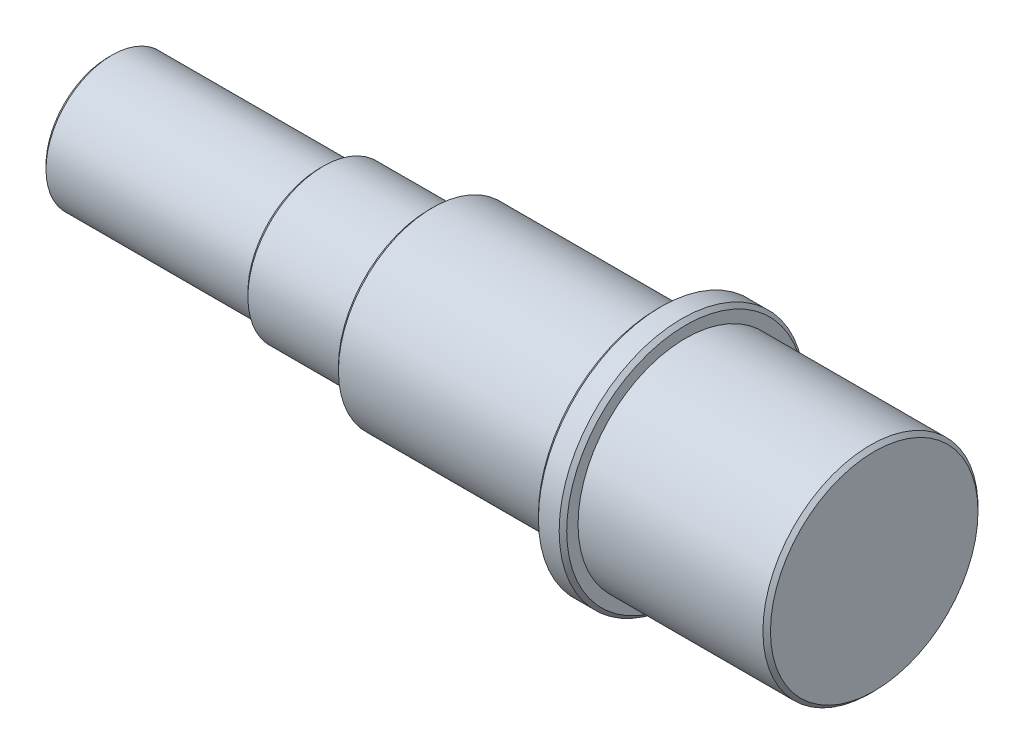
ISO-10303-21;
HEADER;
FILE_DESCRIPTION(('STEP AP214'),'2;1');
FILE_NAME('part.step','',(''),(''),'','','');
FILE_SCHEMA(('AUTOMOTIVE_DESIGN { 1 0 10303 214 1 1 1 1 }'));
ENDSEC;
DATA;
#1=APPLICATION_CONTEXT('core data for automotive mechanical design processes');
#2=APPLICATION_PROTOCOL_DEFINITION('international standard','automotive_design',2000,#1);
#3=PRODUCT_CONTEXT('',#1,'mechanical');
#4=PRODUCT('Part','Part','',(#3));
#5=PRODUCT_RELATED_PRODUCT_CATEGORY('part','',(#4));
#6=PRODUCT_DEFINITION_FORMATION('','',#4);
#7=PRODUCT_DEFINITION_CONTEXT('part definition',#1,'design');
#8=PRODUCT_DEFINITION('design','',#6,#7);
#9=PRODUCT_DEFINITION_SHAPE('','',#8);
#10=(LENGTH_UNIT() NAMED_UNIT(*) SI_UNIT(.MILLI.,.METRE.));
#11=(NAMED_UNIT(*) PLANE_ANGLE_UNIT() SI_UNIT($,.RADIAN.));
#12=(NAMED_UNIT(*) SI_UNIT($,.STERADIAN.) SOLID_ANGLE_UNIT());
#13=UNCERTAINTY_MEASURE_WITH_UNIT(LENGTH_MEASURE(1.E-05),#10,'distance_accuracy_value','');
#14=(GEOMETRIC_REPRESENTATION_CONTEXT(3) GLOBAL_UNCERTAINTY_ASSIGNED_CONTEXT((#13)) GLOBAL_UNIT_ASSIGNED_CONTEXT((#10,
#11,#12)) REPRESENTATION_CONTEXT('',''));
#15=CARTESIAN_POINT('',(0.,0.,0.));
#16=DIRECTION('',(0.,0.,1.));
#17=DIRECTION('',(1.,0.,0.));
#18=AXIS2_PLACEMENT_3D('',#15,#16,#17);
#19=CARTESIAN_POINT('',(0.,0.,0.));
#20=DIRECTION('',(-1.,0.,0.));
#21=DIRECTION('',(0.,0.,1.));
#22=AXIS2_PLACEMENT_3D('',#19,#20,#21);
#23=CYLINDRICAL_SURFACE('',#22,17.5);
#24=CARTESIAN_POINT('',(0.999999999999966,0.,0.));
#25=DIRECTION('',(1.,0.,0.));
#26=DIRECTION('',(0.,0.,-1.));
#27=AXIS2_PLACEMENT_3D('',#24,#25,#26);
#28=CIRCLE('',#27,17.5);
#29=CARTESIAN_POINT('',(0.999999999999966,0.,-17.5));
#30=VERTEX_POINT('',#29);
#31=EDGE_CURVE('E139',#30,#30,#28,.T.);
#32=ORIENTED_EDGE('',*,*,#31,.T.);
#33=EDGE_LOOP('',(#32));
#34=FACE_BOUND('',#33,.T.);
#35=CARTESIAN_POINT('',(56.,0.,0.));
#36=DIRECTION('',(-1.,0.,0.));
#37=DIRECTION('',(0.,0.,1.));
#38=AXIS2_PLACEMENT_3D('',#35,#36,#37);
#39=CIRCLE('',#38,17.5);
#40=CARTESIAN_POINT('',(56.,0.,17.5));
#41=VERTEX_POINT('',#40);
#42=EDGE_CURVE('E131',#41,#41,#39,.T.);
#43=ORIENTED_EDGE('',*,*,#42,.T.);
#44=EDGE_LOOP('',(#43));
#45=FACE_BOUND('',#44,.T.);
#46=CARTESIAN_POINT('',(47.,5.,-16.7705098312484));
#47=CARTESIAN_POINT('',(47.1375437669469,5.00001814544053,-16.7704912725158));
#48=CARTESIAN_POINT('',(47.2750806220229,4.99432529208164,-16.7722013219269));
#49=CARTESIAN_POINT('',(47.5491111892845,4.97165222541634,-16.7789431019967));
#50=CARTESIAN_POINT('',(47.6856051118428,4.95467435267923,-16.7839741438635));
#51=CARTESIAN_POINT('',(47.9562584540195,4.90961903685605,-16.7972068372471));
#52=CARTESIAN_POINT('',(48.0904226248334,4.88156789644729,-16.8054009743523));
#53=CARTESIAN_POINT('',(48.3557996419888,4.81461674604718,-16.8247046364186));
#54=CARTESIAN_POINT('',(48.487012422422,4.77571649404059,-16.8358142264156));
#55=CARTESIAN_POINT('',(48.7455316606223,4.68740449021953,-16.8606149796878));
#56=CARTESIAN_POINT('',(48.8728400553641,4.63799805032664,-16.874304837985));
#57=CARTESIAN_POINT('',(49.1227993627257,4.52905522001709,-16.9038705765848));
#58=CARTESIAN_POINT('',(49.2454485233715,4.46951506432955,-16.9197472690052));
#59=CARTESIAN_POINT('',(49.605208360307,4.27631278448765,-16.9699997678901));
#60=CARTESIAN_POINT('',(49.8342983618955,4.12801150136262,-17.007014905076));
#61=CARTESIAN_POINT('',(50.2705139648694,3.79229915782691,-17.0850471293107));
#62=CARTESIAN_POINT('',(50.476920274657,3.60397767000144,-17.1261428352533));
#63=CARTESIAN_POINT('',(50.8557376930736,3.19544341696383,-17.2070462516998));
#64=CARTESIAN_POINT('',(51.028143164041,2.97522537348192,-17.2468537476932));
#65=CARTESIAN_POINT('',(51.3370780919675,2.50410851659381,-17.3215844019063));
#66=CARTESIAN_POINT('',(51.4728809242985,2.25271539483175,-17.3564029869975));
#67=CARTESIAN_POINT('',(51.7000077123923,1.72950937060037,-17.4163145657263));
#68=CARTESIAN_POINT('',(51.7913423051881,1.45770136944961,-17.4414098849257));
#69=CARTESIAN_POINT('',(51.9245857008507,0.908899275051305,-17.4784878135792));
#70=CARTESIAN_POINT('',(51.9677218545897,0.632225504452072,-17.4907954521753));
#71=CARTESIAN_POINT('',(52.0072166941546,0.0753060921048348,-17.5020523750682));
#72=CARTESIAN_POINT('',(52.0035833309957,-0.204938934421978,-17.5010039299558));
#73=CARTESIAN_POINT('',(51.9504845198055,-0.752451373530218,-17.4859002467781));
#74=CARTESIAN_POINT('',(51.9023476007258,-1.0198597093415,-17.4722220494947));
#75=CARTESIAN_POINT('',(51.7637591704516,-1.54263514692821,-17.433846479088));
#76=CARTESIAN_POINT('',(51.6733055229896,-1.79800164008106,-17.4091485496606));
#77=CARTESIAN_POINT('',(51.4517336287344,-2.29267928834748,-17.3509771517082));
#78=CARTESIAN_POINT('',(51.3201810479175,-2.53178407311227,-17.3174105731756));
#79=CARTESIAN_POINT('',(51.0203556664245,-2.98504901208546,-17.245062612945));
#80=CARTESIAN_POINT('',(50.8520754127235,-3.19920408978386,-17.2062801734237));
#81=CARTESIAN_POINT('',(50.5723726411755,-3.50113424709606,-17.1465202223136));
#82=CARTESIAN_POINT('',(50.4726361356536,-3.60007423743551,-17.1259700648702));
#83=CARTESIAN_POINT('',(50.2651797576601,-3.78923134613091,-17.0851123940087));
#84=CARTESIAN_POINT('',(50.1574626601299,-3.87945147156873,-17.0648047990745));
#85=CARTESIAN_POINT('',(49.9346549590069,-4.05062437518906,-17.0249868857383));
#86=CARTESIAN_POINT('',(49.8195594701279,-4.13157091233148,-17.005477109874));
#87=CARTESIAN_POINT('',(49.582839206299,-4.28353981460235,-16.9678346429649));
#88=CARTESIAN_POINT('',(49.4612169966662,-4.35456603991598,-16.9497014175386));
#89=CARTESIAN_POINT('',(49.2110840486818,-4.48679157824972,-16.9151829895461));
#90=CARTESIAN_POINT('',(49.0825213722029,-4.5478971849676,-16.898814896638));
#91=CARTESIAN_POINT('',(48.82045850364,-4.65898872141545,-16.8685251216221));
#92=CARTESIAN_POINT('',(48.6869603422388,-4.70897916633163,-16.8546024466245));
#93=CARTESIAN_POINT('',(48.4160789886437,-4.79739484975374,-16.829649854127));
#94=CARTESIAN_POINT('',(48.2787000207409,-4.83583217063301,-16.8186169160755));
#95=CARTESIAN_POINT('',(48.0010044543476,-4.90084834749729,-16.7997865631929));
#96=CARTESIAN_POINT('',(47.8606892484807,-4.92743269748005,-16.7919876494693));
#97=CARTESIAN_POINT('',(47.6003348857874,-4.96528740578587,-16.7808301521248));
#98=CARTESIAN_POINT('',(47.4805683702716,-4.97830600651658,-16.776966894118));
#99=CARTESIAN_POINT('',(47.2405377051844,-4.99566040544728,-16.7718034889731));
#100=CARTESIAN_POINT('',(47.120274596223,-5.00000944654161,-16.7704994326599));
#101=CARTESIAN_POINT('',(47.,-5.,-16.7705098312484));
#102=B_SPLINE_CURVE_WITH_KNOTS('',3,(#46,#47,#48,#49,#50,#51,#52,#53,#54,#55,#56,#57,#58,#59,
#60,#61,#62,#63,#64,#65,#66,#67,#68,#69,#70,#71,#72,#73,#74,#75,#76,#77,#78,#79,#80,#81,#82,#83,
#84,#85,#86,#87,#88,#89,#90,#91,#92,#93,#94,#95,#96,#97,#98,#99,#100,#101),.UNSPECIFIED.,.F.,
.F.,(4,2,2,2,2,2,2,2,2,2,2,2,2,2,2,2,2,2,2,2,2,2,2,2,2,2,2,4),(0.,0.412492178804554,
0.824898831357982,1.23633171981252,1.64777378699039,2.05900832185038,2.47039598941262,
3.29264569343991,4.13611232627188,4.97971869650209,5.83900986868947,6.69809539287325,
7.53476732988532,8.3712970310193,9.18363381655588,9.99601161556285,10.8172828992968,
11.6387209961027,12.0642579015972,12.489647531354,12.9153217832844,13.3408299328975,
13.7701489130554,14.1992931759112,14.6279870611799,15.056482034464,15.4177510461265,
15.7784677892952),.UNSPECIFIED.);
#103=CARTESIAN_POINT('',(47.,5.,-16.7705098312484));
#104=VERTEX_POINT('',#103);
#105=CARTESIAN_POINT('',(47.,-5.,-16.7705098312484));
#106=VERTEX_POINT('',#105);
#107=EDGE_CURVE('E183',#104,#106,#102,.T.);
#108=ORIENTED_EDGE('',*,*,#107,.F.);
#109=DIRECTION('',(-1.,0.,0.));
#110=VECTOR('',#109,1.);
#111=CARTESIAN_POINT('',(0.,5.,-16.7705098312484));
#112=LINE('',#111,#110);
#113=CARTESIAN_POINT('',(7.,5.,-16.7705098312484));
#114=VERTEX_POINT('',#113);
#115=EDGE_CURVE('E11',#114,#104,#112,.F.);
#116=ORIENTED_EDGE('',*,*,#115,.F.);
#117=CARTESIAN_POINT('',(7.,-5.,-16.7705098312484));
#118=CARTESIAN_POINT('',(6.86245623305315,-5.00001814544053,-16.7704912725158));
#119=CARTESIAN_POINT('',(6.7249193779771,-4.99432529208164,-16.7722013219269));
#120=CARTESIAN_POINT('',(6.45088881071556,-4.97165222541634,-16.7789431019967));
#121=CARTESIAN_POINT('',(6.31439488815722,-4.95467435267923,-16.7839741438635));
#122=CARTESIAN_POINT('',(6.04374154598052,-4.90961903685605,-16.7972068372471));
#123=CARTESIAN_POINT('',(5.90957737516666,-4.88156789644729,-16.8054009743523));
#124=CARTESIAN_POINT('',(5.64420035801123,-4.81461674604718,-16.8247046364186));
#125=CARTESIAN_POINT('',(5.51298757757803,-4.77571649404059,-16.8358142264156));
#126=CARTESIAN_POINT('',(5.25446833937773,-4.68740449021953,-16.8606149796878));
#127=CARTESIAN_POINT('',(5.12715994463595,-4.63799805032664,-16.874304837985));
#128=CARTESIAN_POINT('',(4.87720063727428,-4.52905522001708,-16.9038705765848));
#129=CARTESIAN_POINT('',(4.75455147662851,-4.46951506432954,-16.9197472690052));
#130=CARTESIAN_POINT('',(4.39479163969302,-4.27631278448765,-16.9699997678901));
#131=CARTESIAN_POINT('',(4.16570163810453,-4.12801150136261,-17.007014905076));
#132=CARTESIAN_POINT('',(3.72948603513064,-3.79229915782691,-17.0850471293107));
#133=CARTESIAN_POINT('',(3.52307972534301,-3.60397767000144,-17.1261428352533));
#134=CARTESIAN_POINT('',(3.14426230692643,-3.19544341696382,-17.2070462516998));
#135=CARTESIAN_POINT('',(2.97185683595896,-2.97522537348191,-17.2468537476932));
#136=CARTESIAN_POINT('',(2.66292190803247,-2.5041085165938,-17.3215844019062));
#137=CARTESIAN_POINT('',(2.52711907570153,-2.25271539483174,-17.3564029869975));
#138=CARTESIAN_POINT('',(2.29999228760769,-1.72950937060037,-17.4163145657263));
#139=CARTESIAN_POINT('',(2.2086576948119,-1.45770136944961,-17.4414098849257));
#140=CARTESIAN_POINT('',(2.07541429914927,-0.908899275051306,-17.4784878135792));
#141=CARTESIAN_POINT('',(2.03227814541032,-0.632225504452074,-17.4907954521753));
#142=CARTESIAN_POINT('',(1.99278330584537,-0.075306092104836,-17.5020523750682));
#143=CARTESIAN_POINT('',(1.99641666900432,0.204938934421977,-17.5010039299558));
#144=CARTESIAN_POINT('',(2.04951548019445,0.752451373530218,-17.4859002467781));
#145=CARTESIAN_POINT('',(2.09765239927417,1.0198597093415,-17.4722220494947));
#146=CARTESIAN_POINT('',(2.23624082954846,1.54263514692821,-17.433846479088));
#147=CARTESIAN_POINT('',(2.32669447701045,1.79800164008106,-17.4091485496606));
#148=CARTESIAN_POINT('',(2.54826637126564,2.29267928834748,-17.3509771517082));
#149=CARTESIAN_POINT('',(2.6798189520825,2.53178407311227,-17.3174105731756));
#150=CARTESIAN_POINT('',(2.97964433357547,2.98504901208546,-17.2450626129451));
#151=CARTESIAN_POINT('',(3.14792458727652,3.19920408978386,-17.2062801734237));
#152=CARTESIAN_POINT('',(3.42762735882451,3.50113424709606,-17.1465202223136));
#153=CARTESIAN_POINT('',(3.52736386434642,3.60007423743551,-17.1259700648702));
#154=CARTESIAN_POINT('',(3.73482024233988,3.78923134613091,-17.0851123940087));
#155=CARTESIAN_POINT('',(3.84253733987009,3.87945147156873,-17.0648047990745));
#156=CARTESIAN_POINT('',(4.06534504099315,4.05062437518906,-17.0249868857383));
#157=CARTESIAN_POINT('',(4.18044052987208,4.13157091233148,-17.005477109874));
#158=CARTESIAN_POINT('',(4.41716079370096,4.28353981460235,-16.9678346429649));
#159=CARTESIAN_POINT('',(4.53878300333382,4.35456603991598,-16.9497014175386));
#160=CARTESIAN_POINT('',(4.78891595131824,4.48679157824972,-16.9151829895461));
#161=CARTESIAN_POINT('',(4.91747862779708,4.5478971849676,-16.898814896638));
#162=CARTESIAN_POINT('',(5.17954149635999,4.65898872141545,-16.8685251216221));
#163=CARTESIAN_POINT('',(5.31303965776125,4.70897916633163,-16.8546024466245));
#164=CARTESIAN_POINT('',(5.58392101135627,4.79739484975374,-16.829649854127));
#165=CARTESIAN_POINT('',(5.72129997925907,4.83583217063301,-16.8186169160755));
#166=CARTESIAN_POINT('',(5.99899554565236,4.90084834749729,-16.7997865631929));
#167=CARTESIAN_POINT('',(6.13931075151927,4.92743269748005,-16.7919876494693));
#168=CARTESIAN_POINT('',(6.39966511421258,4.96528740578587,-16.7808301521248));
#169=CARTESIAN_POINT('',(6.51943162972835,4.97830600651658,-16.776966894118));
#170=CARTESIAN_POINT('',(6.75946229481565,4.99566040544728,-16.7718034889731));
#171=CARTESIAN_POINT('',(6.87972540377703,5.00000944654161,-16.7704994326599));
#172=CARTESIAN_POINT('',(7.,5.,-16.7705098312484));
#173=B_SPLINE_CURVE_WITH_KNOTS('',3,(#117,#118,#119,#120,#121,#122,#123,#124,#125,#126,#127,
#128,#129,#130,#131,#132,#133,#134,#135,#136,#137,#138,#139,#140,#141,#142,#143,#144,#145,#146,
#147,#148,#149,#150,#151,#152,#153,#154,#155,#156,#157,#158,#159,#160,#161,#162,#163,#164,#165,
#166,#167,#168,#169,#170,#171,#172),.UNSPECIFIED.,.F.,.F.,(4,2,2,2,2,2,2,2,2,2,2,2,2,2,2,2,2,2,
2,2,2,2,2,2,2,2,2,4),(0.,0.412492178804548,0.82489883135798,1.23633171981252,1.64777378699039,
2.05900832185039,2.47039598941263,3.29264569343992,4.13611232627189,4.9797186965021,
5.83900986868948,6.69809539287325,7.53476732988532,8.3712970310193,9.18363381655588,
9.99601161556285,10.8172828992968,11.6387209961027,12.0642579015972,12.489647531354,
12.9153217832844,13.3408299328975,13.7701489130555,14.1992931759112,14.6279870611799,
15.056482034464,15.4177510461265,15.7784677892953),.UNSPECIFIED.);
#174=CARTESIAN_POINT('',(7.,-5.,-16.7705098312484));
#175=VERTEX_POINT('',#174);
#176=EDGE_CURVE('E57',#175,#114,#173,.T.);
#177=ORIENTED_EDGE('',*,*,#176,.F.);
#178=DIRECTION('',(-1.,0.,0.));
#179=VECTOR('',#178,1.);
#180=CARTESIAN_POINT('',(0.,-5.,-16.7705098312484));
#181=LINE('',#180,#179);
#182=EDGE_CURVE('E109',#106,#175,#181,.T.);
#183=ORIENTED_EDGE('',*,*,#182,.F.);
#184=EDGE_LOOP('',(#108,#116,#177,#183));
#185=FACE_BOUND('',#184,.T.);
#186=ADVANCED_FACE('F47',(#34,#45,#185),#23,.T.);
#187=CARTESIAN_POINT('',(0.,0.,0.));
#188=DIRECTION('',(1.,0.,0.));
#189=DIRECTION('',(0.,0.,-1.));
#190=AXIS2_PLACEMENT_3D('',#187,#188,#189);
#191=PLANE('',#190);
#192=CARTESIAN_POINT('',(0.,0.,0.));
#193=DIRECTION('',(1.,0.,0.));
#194=DIRECTION('',(0.,0.,-1.));
#195=AXIS2_PLACEMENT_3D('',#192,#193,#194);
#196=CIRCLE('',#195,16.5);
#197=CARTESIAN_POINT('',(0.,0.,-16.5));
#198=VERTEX_POINT('',#197);
#199=EDGE_CURVE('E135',#198,#198,#196,.F.);
#200=ORIENTED_EDGE('',*,*,#199,.T.);
#201=EDGE_LOOP('',(#200));
#202=FACE_BOUND('',#201,.T.);
#203=ADVANCED_FACE('F257',(#202),#191,.F.);
#204=CARTESIAN_POINT('',(56.,20.,0.));
#205=DIRECTION('',(1.,0.,0.));
#206=DIRECTION('',(0.,0.,-1.));
#207=AXIS2_PLACEMENT_3D('',#204,#205,#206);
#208=PLANE('',#207);
#209=CARTESIAN_POINT('',(56.,0.,0.));
#210=DIRECTION('',(1.,0.,0.));
#211=DIRECTION('',(0.,0.,-1.));
#212=AXIS2_PLACEMENT_3D('',#209,#210,#211);
#213=CIRCLE('',#212,19.);
#214=CARTESIAN_POINT('',(56.,0.,-19.));
#215=VERTEX_POINT('',#214);
#216=EDGE_CURVE('E143',#215,#215,#213,.F.);
#217=ORIENTED_EDGE('',*,*,#216,.T.);
#218=EDGE_LOOP('',(#217));
#219=FACE_BOUND('',#218,.T.);
#220=ORIENTED_EDGE('',*,*,#42,.F.);
#221=EDGE_LOOP('',(#220));
#222=FACE_BOUND('',#221,.T.);
#223=ADVANCED_FACE('F263',(#219,#222),#208,.F.);
#224=CARTESIAN_POINT('',(0.,0.,0.));
#225=DIRECTION('',(-1.,0.,0.));
#226=DIRECTION('',(0.,0.,1.));
#227=AXIS2_PLACEMENT_3D('',#224,#225,#226);
#228=CYLINDRICAL_SURFACE('',#227,20.);
#229=CARTESIAN_POINT('',(57.,0.,0.));
#230=DIRECTION('',(1.,0.,0.));
#231=DIRECTION('',(0.,0.,-1.));
#232=AXIS2_PLACEMENT_3D('',#229,#230,#231);
#233=CIRCLE('',#232,20.);
#234=CARTESIAN_POINT('',(57.,0.,-20.));
#235=VERTEX_POINT('',#234);
#236=EDGE_CURVE('E147',#235,#235,#233,.T.);
#237=ORIENTED_EDGE('',*,*,#236,.T.);
#238=EDGE_LOOP('',(#237));
#239=FACE_BOUND('',#238,.T.);
#240=CARTESIAN_POINT('',(85.,0.,0.));
#241=DIRECTION('',(-1.,0.,0.));
#242=DIRECTION('',(0.,0.,1.));
#243=AXIS2_PLACEMENT_3D('',#240,#241,#242);
#244=CIRCLE('',#243,20.);
#245=CARTESIAN_POINT('',(85.,0.,20.));
#246=VERTEX_POINT('',#245);
#247=EDGE_CURVE('E127',#246,#246,#244,.T.);
#248=ORIENTED_EDGE('',*,*,#247,.T.);
#249=EDGE_LOOP('',(#248));
#250=FACE_BOUND('',#249,.T.);
#251=ADVANCED_FACE('F270',(#239,#250),#228,.T.);
#252=CARTESIAN_POINT('',(85.,20.,0.));
#253=DIRECTION('',(1.,0.,0.));
#254=DIRECTION('',(0.,0.,-1.));
#255=AXIS2_PLACEMENT_3D('',#252,#253,#254);
#256=PLANE('',#255);
#257=CARTESIAN_POINT('',(85.,0.,0.));
#258=DIRECTION('',(1.,0.,0.));
#259=DIRECTION('',(0.,0.,-1.));
#260=AXIS2_PLACEMENT_3D('',#257,#258,#259);
#261=CIRCLE('',#260,24.);
#262=CARTESIAN_POINT('',(85.,0.,-24.));
#263=VERTEX_POINT('',#262);
#264=EDGE_CURVE('E151',#263,#263,#261,.F.);
#265=ORIENTED_EDGE('',*,*,#264,.T.);
#266=EDGE_LOOP('',(#265));
#267=FACE_BOUND('',#266,.T.);
#268=ORIENTED_EDGE('',*,*,#247,.F.);
#269=EDGE_LOOP('',(#268));
#270=FACE_BOUND('',#269,.T.);
#271=ADVANCED_FACE('F275',(#267,#270),#256,.F.);
#272=CARTESIAN_POINT('',(0.,0.,0.));
#273=DIRECTION('',(-1.,0.,0.));
#274=DIRECTION('',(0.,0.,1.));
#275=AXIS2_PLACEMENT_3D('',#272,#273,#274);
#276=CYLINDRICAL_SURFACE('',#275,25.);
#277=CARTESIAN_POINT('',(86.0000000000001,0.,0.));
#278=DIRECTION('',(1.,0.,0.));
#279=DIRECTION('',(0.,0.,-1.));
#280=AXIS2_PLACEMENT_3D('',#277,#278,#279);
#281=CIRCLE('',#280,25.);
#282=CARTESIAN_POINT('',(86.0000000000001,0.,-25.));
#283=VERTEX_POINT('',#282);
#284=EDGE_CURVE('E155',#283,#283,#281,.T.);
#285=ORIENTED_EDGE('',*,*,#284,.T.);
#286=EDGE_LOOP('',(#285));
#287=FACE_BOUND('',#286,.T.);
#288=CARTESIAN_POINT('',(145.5,0.,0.));
#289=DIRECTION('',(-1.,0.,0.));
#290=DIRECTION('',(0.,0.,1.));
#291=AXIS2_PLACEMENT_3D('',#288,#289,#290);
#292=CIRCLE('',#291,25.);
#293=CARTESIAN_POINT('',(145.5,0.,25.));
#294=VERTEX_POINT('',#293);
#295=EDGE_CURVE('E118',#294,#294,#292,.T.);
#296=ORIENTED_EDGE('',*,*,#295,.T.);
#297=EDGE_LOOP('',(#296));
#298=FACE_BOUND('',#297,.T.);
#299=ADVANCED_FACE('F281',(#287,#298),#276,.T.);
#300=CARTESIAN_POINT('',(145.5,25.,0.));
#301=DIRECTION('',(1.,0.,0.));
#302=DIRECTION('',(0.,0.,-1.));
#303=AXIS2_PLACEMENT_3D('',#300,#301,#302);
#304=PLANE('',#303);
#305=CARTESIAN_POINT('',(145.5,0.,0.));
#306=DIRECTION('',(1.,0.,0.));
#307=DIRECTION('',(0.,0.,-1.));
#308=AXIS2_PLACEMENT_3D('',#305,#306,#307);
#309=CIRCLE('',#308,31.5);
#310=CARTESIAN_POINT('',(145.5,0.,-31.5));
#311=VERTEX_POINT('',#310);
#312=EDGE_CURVE('E159',#311,#311,#309,.F.);
#313=ORIENTED_EDGE('',*,*,#312,.T.);
#314=EDGE_LOOP('',(#313));
#315=FACE_BOUND('',#314,.T.);
#316=ORIENTED_EDGE('',*,*,#295,.F.);
#317=EDGE_LOOP('',(#316));
#318=FACE_BOUND('',#317,.T.);
#319=ADVANCED_FACE('F285',(#315,#318),#304,.F.);
#320=CARTESIAN_POINT('',(0.,0.,0.));
#321=DIRECTION('',(-1.,0.,0.));
#322=DIRECTION('',(0.,0.,1.));
#323=AXIS2_PLACEMENT_3D('',#320,#321,#322);
#324=CYLINDRICAL_SURFACE('',#323,32.5);
#325=CARTESIAN_POINT('',(146.5,0.,0.));
#326=DIRECTION('',(1.,0.,0.));
#327=DIRECTION('',(0.,0.,-1.));
#328=AXIS2_PLACEMENT_3D('',#325,#326,#327);
#329=CIRCLE('',#328,32.5);
#330=CARTESIAN_POINT('',(146.5,0.,-32.5));
#331=VERTEX_POINT('',#330);
#332=EDGE_CURVE('E167',#331,#331,#329,.T.);
#333=ORIENTED_EDGE('',*,*,#332,.T.);
#334=EDGE_LOOP('',(#333));
#335=FACE_BOUND('',#334,.T.);
#336=CARTESIAN_POINT('',(152.,0.,0.));
#337=DIRECTION('',(-1.,0.,0.));
#338=DIRECTION('',(0.,0.,1.));
#339=AXIS2_PLACEMENT_3D('',#336,#337,#338);
#340=CIRCLE('',#339,32.5);
#341=CARTESIAN_POINT('',(152.,0.,32.5));
#342=VERTEX_POINT('',#341);
#343=EDGE_CURVE('E163',#342,#342,#340,.T.);
#344=ORIENTED_EDGE('',*,*,#343,.T.);
#345=EDGE_LOOP('',(#344));
#346=FACE_BOUND('',#345,.T.);
#347=ADVANCED_FACE('F289',(#335,#346),#324,.T.);
#348=CARTESIAN_POINT('',(153.,32.5,0.));
#349=DIRECTION('',(-1.,0.,0.));
#350=DIRECTION('',(0.,0.,1.));
#351=AXIS2_PLACEMENT_3D('',#348,#349,#350);
#352=PLANE('',#351);
#353=CARTESIAN_POINT('',(153.,0.,0.));
#354=DIRECTION('',(-1.,0.,0.));
#355=DIRECTION('',(0.,0.,1.));
#356=AXIS2_PLACEMENT_3D('',#353,#354,#355);
#357=CIRCLE('',#356,31.5);
#358=CARTESIAN_POINT('',(153.,0.,31.5));
#359=VERTEX_POINT('',#358);
#360=EDGE_CURVE('E171',#359,#359,#357,.F.);
#361=ORIENTED_EDGE('',*,*,#360,.T.);
#362=EDGE_LOOP('',(#361));
#363=FACE_BOUND('',#362,.T.);
#364=CARTESIAN_POINT('',(153.,0.,0.));
#365=DIRECTION('',(-1.,0.,0.));
#366=DIRECTION('',(0.,0.,1.));
#367=AXIS2_PLACEMENT_3D('',#364,#365,#366);
#368=CIRCLE('',#367,28.5);
#369=CARTESIAN_POINT('',(153.,0.,28.5));
#370=VERTEX_POINT('',#369);
#371=EDGE_CURVE('E111',#370,#370,#368,.T.);
#372=ORIENTED_EDGE('',*,*,#371,.T.);
#373=EDGE_LOOP('',(#372));
#374=FACE_BOUND('',#373,.T.);
#375=ADVANCED_FACE('F293',(#363,#374),#352,.F.);
#376=CARTESIAN_POINT('',(0.,0.,0.));
#377=DIRECTION('',(-1.,0.,0.));
#378=DIRECTION('',(0.,0.,1.));
#379=AXIS2_PLACEMENT_3D('',#376,#377,#378);
#380=CYLINDRICAL_SURFACE('',#379,28.5);
#381=CARTESIAN_POINT('',(202.,0.,0.));
#382=DIRECTION('',(-1.,0.,0.));
#383=DIRECTION('',(0.,0.,1.));
#384=AXIS2_PLACEMENT_3D('',#381,#382,#383);
#385=CIRCLE('',#384,28.5);
#386=CARTESIAN_POINT('',(202.,0.,28.5));
#387=VERTEX_POINT('',#386);
#388=EDGE_CURVE('E175',#387,#387,#385,.T.);
#389=ORIENTED_EDGE('',*,*,#388,.T.);
#390=EDGE_LOOP('',(#389));
#391=FACE_BOUND('',#390,.T.);
#392=ORIENTED_EDGE('',*,*,#371,.F.);
#393=EDGE_LOOP('',(#392));
#394=FACE_BOUND('',#393,.T.);
#395=ADVANCED_FACE('F296',(#391,#394),#380,.T.);
#396=CARTESIAN_POINT('',(203.,28.5,0.));
#397=DIRECTION('',(-1.,0.,0.));
#398=DIRECTION('',(0.,0.,1.));
#399=AXIS2_PLACEMENT_3D('',#396,#397,#398);
#400=PLANE('',#399);
#401=CARTESIAN_POINT('',(203.,0.,0.));
#402=DIRECTION('',(-1.,0.,0.));
#403=DIRECTION('',(0.,0.,1.));
#404=AXIS2_PLACEMENT_3D('',#401,#402,#403);
#405=CIRCLE('',#404,27.5);
#406=CARTESIAN_POINT('',(203.,0.,27.5));
#407=VERTEX_POINT('',#406);
#408=EDGE_CURVE('E179',#407,#407,#405,.F.);
#409=ORIENTED_EDGE('',*,*,#408,.T.);
#410=EDGE_LOOP('',(#409));
#411=FACE_BOUND('',#410,.T.);
#412=ADVANCED_FACE('F208',(#411),#400,.F.);
#413=CARTESIAN_POINT('',(0.,0.,0.));
#414=DIRECTION('',(1.,0.,0.));
#415=DIRECTION('',(0.,0.,-1.));
#416=AXIS2_PLACEMENT_3D('',#413,#414,#415);
#417=CONICAL_SURFACE('',#416,16.5,0.785398163397445);
#418=ORIENTED_EDGE('',*,*,#31,.F.);
#419=EDGE_LOOP('',(#418));
#420=FACE_BOUND('',#419,.T.);
#421=ORIENTED_EDGE('',*,*,#199,.F.);
#422=EDGE_LOOP('',(#421));
#423=FACE_BOUND('',#422,.T.);
#424=ADVANCED_FACE('F303',(#420,#423),#417,.T.);
#425=CARTESIAN_POINT('',(56.,0.,0.));
#426=DIRECTION('',(1.,0.,0.));
#427=DIRECTION('',(0.,0.,-1.));
#428=AXIS2_PLACEMENT_3D('',#425,#426,#427);
#429=CONICAL_SURFACE('',#428,19.,0.785398163397454);
#430=ORIENTED_EDGE('',*,*,#236,.F.);
#431=EDGE_LOOP('',(#430));
#432=FACE_BOUND('',#431,.T.);
#433=ORIENTED_EDGE('',*,*,#216,.F.);
#434=EDGE_LOOP('',(#433));
#435=FACE_BOUND('',#434,.T.);
#436=ADVANCED_FACE('F339',(#432,#435),#429,.T.);
#437=CARTESIAN_POINT('',(85.,0.,0.));
#438=DIRECTION('',(1.,0.,0.));
#439=DIRECTION('',(0.,0.,-1.));
#440=AXIS2_PLACEMENT_3D('',#437,#438,#439);
#441=CONICAL_SURFACE('',#440,24.,0.785398163397445);
#442=ORIENTED_EDGE('',*,*,#284,.F.);
#443=EDGE_LOOP('',(#442));
#444=FACE_BOUND('',#443,.T.);
#445=ORIENTED_EDGE('',*,*,#264,.F.);
#446=EDGE_LOOP('',(#445));
#447=FACE_BOUND('',#446,.T.);
#448=ADVANCED_FACE('F321',(#444,#447),#441,.T.);
#449=CARTESIAN_POINT('',(145.5,0.,0.));
#450=DIRECTION('',(1.,0.,0.));
#451=DIRECTION('',(0.,0.,-1.));
#452=AXIS2_PLACEMENT_3D('',#449,#450,#451);
#453=CONICAL_SURFACE('',#452,31.5,0.785398163397445);
#454=ORIENTED_EDGE('',*,*,#332,.F.);
#455=EDGE_LOOP('',(#454));
#456=FACE_BOUND('',#455,.T.);
#457=ORIENTED_EDGE('',*,*,#312,.F.);
#458=EDGE_LOOP('',(#457));
#459=FACE_BOUND('',#458,.T.);
#460=ADVANCED_FACE('F315',(#456,#459),#453,.T.);
#461=CARTESIAN_POINT('',(152.,0.,0.));
#462=DIRECTION('',(-1.,0.,0.));
#463=DIRECTION('',(0.,0.,1.));
#464=AXIS2_PLACEMENT_3D('',#461,#462,#463);
#465=CONICAL_SURFACE('',#464,32.5,0.785398163397431);
#466=ORIENTED_EDGE('',*,*,#360,.F.);
#467=EDGE_LOOP('',(#466));
#468=FACE_BOUND('',#467,.T.);
#469=ORIENTED_EDGE('',*,*,#343,.F.);
#470=EDGE_LOOP('',(#469));
#471=FACE_BOUND('',#470,.T.);
#472=ADVANCED_FACE('F310',(#468,#471),#465,.T.);
#473=CARTESIAN_POINT('',(202.,0.,0.));
#474=DIRECTION('',(-1.,0.,0.));
#475=DIRECTION('',(0.,0.,1.));
#476=AXIS2_PLACEMENT_3D('',#473,#474,#475);
#477=CONICAL_SURFACE('',#476,28.5,0.785398163397462);
#478=ORIENTED_EDGE('',*,*,#408,.F.);
#479=EDGE_LOOP('',(#478));
#480=FACE_BOUND('',#479,.T.);
#481=ORIENTED_EDGE('',*,*,#388,.F.);
#482=EDGE_LOOP('',(#481));
#483=FACE_BOUND('',#482,.T.);
#484=ADVANCED_FACE('F50',(#480,#483),#477,.T.);
#485=CARTESIAN_POINT('',(7.,0.,-12.5));
#486=DIRECTION('',(0.,0.,-1.));
#487=DIRECTION('',(-1.,0.,0.));
#488=AXIS2_PLACEMENT_3D('',#485,#486,#487);
#489=CYLINDRICAL_SURFACE('',#488,5.);
#490=DIRECTION('',(0.,0.,-1.));
#491=VECTOR('',#490,1.);
#492=CARTESIAN_POINT('',(7.,-5.,-12.5));
#493=LINE('',#492,#491);
#494=CARTESIAN_POINT('',(7.,-5.,-12.5));
#495=VERTEX_POINT('',#494);
#496=EDGE_CURVE('E105',#495,#175,#493,.T.);
#497=ORIENTED_EDGE('',*,*,#496,.T.);
#498=ORIENTED_EDGE('',*,*,#176,.T.);
#499=DIRECTION('',(0.,0.,-1.));
#500=VECTOR('',#499,1.);
#501=CARTESIAN_POINT('',(7.,5.,-12.5));
#502=LINE('',#501,#500);
#503=CARTESIAN_POINT('',(7.,5.,-12.5));
#504=VERTEX_POINT('',#503);
#505=EDGE_CURVE('E63',#504,#114,#502,.T.);
#506=ORIENTED_EDGE('',*,*,#505,.F.);
#507=CARTESIAN_POINT('',(7.,0.,-12.5));
#508=DIRECTION('',(0.,0.,1.));
#509=DIRECTION('',(1.,0.,0.));
#510=AXIS2_PLACEMENT_3D('',#507,#508,#509);
#511=CIRCLE('',#510,5.);
#512=EDGE_CURVE('E94',#504,#495,#511,.T.);
#513=ORIENTED_EDGE('',*,*,#512,.T.);
#514=EDGE_LOOP('',(#497,#498,#506,#513));
#515=FACE_BOUND('',#514,.T.);
#516=ADVANCED_FACE('F104',(#515),#489,.F.);
#517=CARTESIAN_POINT('',(7.,-5.,-12.5));
#518=DIRECTION('',(0.,1.,0.));
#519=DIRECTION('',(0.,0.,1.));
#520=AXIS2_PLACEMENT_3D('',#517,#518,#519);
#521=PLANE('',#520);
#522=ORIENTED_EDGE('',*,*,#182,.T.);
#523=ORIENTED_EDGE('',*,*,#496,.F.);
#524=DIRECTION('',(1.,0.,0.));
#525=VECTOR('',#524,1.);
#526=CARTESIAN_POINT('',(7.,-5.,-12.5));
#527=LINE('',#526,#525);
#528=CARTESIAN_POINT('',(47.,-5.,-12.5));
#529=VERTEX_POINT('',#528);
#530=EDGE_CURVE('E90',#495,#529,#527,.T.);
#531=ORIENTED_EDGE('',*,*,#530,.T.);
#532=DIRECTION('',(0.,0.,-1.));
#533=VECTOR('',#532,1.);
#534=CARTESIAN_POINT('',(47.,-5.,-12.5));
#535=LINE('',#534,#533);
#536=EDGE_CURVE('E112',#529,#106,#535,.T.);
#537=ORIENTED_EDGE('',*,*,#536,.T.);
#538=EDGE_LOOP('',(#522,#523,#531,#537));
#539=FACE_BOUND('',#538,.T.);
#540=ADVANCED_FACE('F108',(#539),#521,.T.);
#541=CARTESIAN_POINT('',(47.,0.,-12.5));
#542=DIRECTION('',(0.,0.,-1.));
#543=DIRECTION('',(-1.,0.,0.));
#544=AXIS2_PLACEMENT_3D('',#541,#542,#543);
#545=CYLINDRICAL_SURFACE('',#544,5.);
#546=DIRECTION('',(0.,0.,-1.));
#547=VECTOR('',#546,1.);
#548=CARTESIAN_POINT('',(47.,5.,-12.5));
#549=LINE('',#548,#547);
#550=CARTESIAN_POINT('',(47.,5.,-12.5));
#551=VERTEX_POINT('',#550);
#552=EDGE_CURVE('E120',#551,#104,#549,.T.);
#553=ORIENTED_EDGE('',*,*,#552,.T.);
#554=ORIENTED_EDGE('',*,*,#107,.T.);
#555=ORIENTED_EDGE('',*,*,#536,.F.);
#556=CARTESIAN_POINT('',(47.,0.,-12.5));
#557=DIRECTION('',(0.,0.,1.));
#558=DIRECTION('',(1.,0.,0.));
#559=AXIS2_PLACEMENT_3D('',#556,#557,#558);
#560=CIRCLE('',#559,5.);
#561=EDGE_CURVE('E95',#529,#551,#560,.T.);
#562=ORIENTED_EDGE('',*,*,#561,.T.);
#563=EDGE_LOOP('',(#553,#554,#555,#562));
#564=FACE_BOUND('',#563,.T.);
#565=ADVANCED_FACE('F195',(#564),#545,.F.);
#566=CARTESIAN_POINT('',(7.,5.,-12.5));
#567=DIRECTION('',(0.,-1.,0.));
#568=DIRECTION('',(0.,0.,-1.));
#569=AXIS2_PLACEMENT_3D('',#566,#567,#568);
#570=PLANE('',#569);
#571=ORIENTED_EDGE('',*,*,#115,.T.);
#572=ORIENTED_EDGE('',*,*,#552,.F.);
#573=DIRECTION('',(-1.,0.,0.));
#574=VECTOR('',#573,1.);
#575=CARTESIAN_POINT('',(7.,5.,-12.5));
#576=LINE('',#575,#574);
#577=EDGE_CURVE('E240',#551,#504,#576,.T.);
#578=ORIENTED_EDGE('',*,*,#577,.T.);
#579=ORIENTED_EDGE('',*,*,#505,.T.);
#580=EDGE_LOOP('',(#571,#572,#578,#579));
#581=FACE_BOUND('',#580,.T.);
#582=ADVANCED_FACE('F200',(#581),#570,.T.);
#583=CARTESIAN_POINT('',(7.,0.,-12.5));
#584=DIRECTION('',(0.,0.,1.));
#585=DIRECTION('',(1.,0.,0.));
#586=AXIS2_PLACEMENT_3D('',#583,#584,#585);
#587=PLANE('',#586);
#588=ORIENTED_EDGE('',*,*,#512,.F.);
#589=ORIENTED_EDGE('',*,*,#577,.F.);
#590=ORIENTED_EDGE('',*,*,#561,.F.);
#591=ORIENTED_EDGE('',*,*,#530,.F.);
#592=EDGE_LOOP('',(#588,#589,#590,#591));
#593=FACE_BOUND('',#592,.T.);
#594=ADVANCED_FACE('F92',(#593),#587,.F.);
#595=CLOSED_SHELL('',(#186,#203,#223,#251,#271,#299,#319,#347,#375,#395,#412,#424,#436,#448,
#460,#472,#484,#516,#540,#565,#582,#594));
#596=MANIFOLD_SOLID_BREP('B2',#595);
#597=ADVANCED_BREP_SHAPE_REPRESENTATION('',(#18,#596),#14);
#598=SHAPE_DEFINITION_REPRESENTATION(#9,#597);
ENDSEC;
END-ISO-10303-21;
